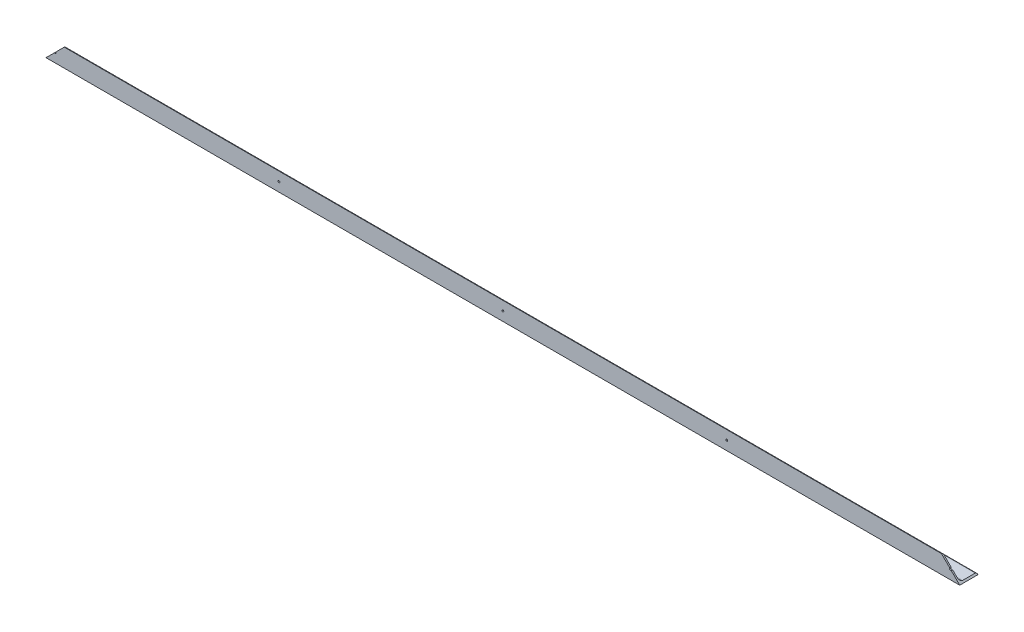
ISO-10303-21;
HEADER;
FILE_DESCRIPTION(('STEP AP214'),'2;1');
FILE_NAME('part.step','',(''),(''),'','','');
FILE_SCHEMA(('AUTOMOTIVE_DESIGN { 1 0 10303 214 1 1 1 1 }'));
ENDSEC;
DATA;
#1=APPLICATION_CONTEXT('core data for automotive mechanical design processes');
#2=APPLICATION_PROTOCOL_DEFINITION('international standard','automotive_design',2000,#1);
#3=PRODUCT_CONTEXT('',#1,'mechanical');
#4=PRODUCT('Part','Part','',(#3));
#5=PRODUCT_RELATED_PRODUCT_CATEGORY('part','',(#4));
#6=PRODUCT_DEFINITION_FORMATION('','',#4);
#7=PRODUCT_DEFINITION_CONTEXT('part definition',#1,'design');
#8=PRODUCT_DEFINITION('design','',#6,#7);
#9=PRODUCT_DEFINITION_SHAPE('','',#8);
#10=(LENGTH_UNIT() NAMED_UNIT(*) SI_UNIT(.MILLI.,.METRE.));
#11=(NAMED_UNIT(*) PLANE_ANGLE_UNIT() SI_UNIT($,.RADIAN.));
#12=(NAMED_UNIT(*) SI_UNIT($,.STERADIAN.) SOLID_ANGLE_UNIT());
#13=UNCERTAINTY_MEASURE_WITH_UNIT(LENGTH_MEASURE(1.E-05),#10,'distance_accuracy_value','');
#14=(GEOMETRIC_REPRESENTATION_CONTEXT(3) GLOBAL_UNCERTAINTY_ASSIGNED_CONTEXT((#13)) GLOBAL_UNIT_ASSIGNED_CONTEXT((#10,
#11,#12)) REPRESENTATION_CONTEXT('',''));
#15=CARTESIAN_POINT('',(0.,0.,0.));
#16=DIRECTION('',(0.,0.,1.));
#17=DIRECTION('',(1.,0.,0.));
#18=AXIS2_PLACEMENT_3D('',#15,#16,#17);
#19=CARTESIAN_POINT('',(2000.,0.,-40.));
#20=DIRECTION('',(0.,1.,0.));
#21=DIRECTION('',(0.,0.,1.));
#22=AXIS2_PLACEMENT_3D('',#19,#20,#21);
#23=PLANE('',#22);
#24=DIRECTION('',(0.,0.,-1.));
#25=VECTOR('',#24,1.);
#26=CARTESIAN_POINT('',(0.,0.,-40.));
#27=LINE('',#26,#25);
#28=CARTESIAN_POINT('',(0.,0.,0.));
#29=VERTEX_POINT('',#28);
#30=CARTESIAN_POINT('',(0.,0.,-40.));
#31=VERTEX_POINT('',#30);
#32=EDGE_CURVE('E163',#29,#31,#27,.T.);
#33=ORIENTED_EDGE('',*,*,#32,.T.);
#34=DIRECTION('',(-1.,0.,0.));
#35=VECTOR('',#34,1.);
#36=CARTESIAN_POINT('',(2000.,0.,-40.));
#37=LINE('',#36,#35);
#38=CARTESIAN_POINT('',(2000.,0.,-40.));
#39=VERTEX_POINT('',#38);
#40=EDGE_CURVE('E13',#39,#31,#37,.T.);
#41=ORIENTED_EDGE('',*,*,#40,.F.);
#42=DIRECTION('',(0.,0.,-1.));
#43=VECTOR('',#42,1.);
#44=CARTESIAN_POINT('',(2000.,0.,-40.));
#45=LINE('',#44,#43);
#46=CARTESIAN_POINT('',(2000.,0.,0.));
#47=VERTEX_POINT('',#46);
#48=EDGE_CURVE('E270',#47,#39,#45,.T.);
#49=ORIENTED_EDGE('',*,*,#48,.F.);
#50=DIRECTION('',(-1.,0.,0.));
#51=VECTOR('',#50,1.);
#52=CARTESIAN_POINT('',(2000.,0.,0.));
#53=LINE('',#52,#51);
#54=EDGE_CURVE('E273',#47,#29,#53,.T.);
#55=ORIENTED_EDGE('',*,*,#54,.T.);
#56=EDGE_LOOP('',(#33,#41,#49,#55));
#57=FACE_BOUND('',#56,.T.);
#58=ADVANCED_FACE('F65',(#57),#23,.F.);
#59=CARTESIAN_POINT('',(2000.,0.,-37.));
#60=DIRECTION('',(-1.,0.,0.));
#61=DIRECTION('',(0.,0.,1.));
#62=AXIS2_PLACEMENT_3D('',#59,#60,#61);
#63=CYLINDRICAL_SURFACE('',#62,3.);
#64=ORIENTED_EDGE('',*,*,#40,.T.);
#65=CARTESIAN_POINT('',(0.,0.,-37.));
#66=DIRECTION('',(0.707106781186548,-0.707106781186548,0.));
#67=DIRECTION('',(-0.707106781186548,-0.707106781186548,0.));
#68=AXIS2_PLACEMENT_3D('',#65,#66,#67);
#69=ELLIPSE('',#68,4.24264068711928,3.);
#70=CARTESIAN_POINT('',(3.00000000000011,3.,-37.));
#71=VERTEX_POINT('',#70);
#72=EDGE_CURVE('E216',#31,#71,#69,.T.);
#73=ORIENTED_EDGE('',*,*,#72,.T.);
#74=DIRECTION('',(-1.,0.,0.));
#75=VECTOR('',#74,1.);
#76=CARTESIAN_POINT('',(2000.,3.,-37.));
#77=LINE('',#76,#75);
#78=CARTESIAN_POINT('',(1997.,3.,-37.));
#79=VERTEX_POINT('',#78);
#80=EDGE_CURVE('E74',#79,#71,#77,.T.);
#81=ORIENTED_EDGE('',*,*,#80,.F.);
#82=CARTESIAN_POINT('',(2000.,0.,-37.));
#83=DIRECTION('',(-0.707106781186552,-0.707106781186543,0.));
#84=DIRECTION('',(-0.707106781186543,0.707106781186552,0.));
#85=AXIS2_PLACEMENT_3D('',#82,#83,#84);
#86=ELLIPSE('',#85,4.24264068711925,3.);
#87=EDGE_CURVE('E232',#79,#39,#86,.T.);
#88=ORIENTED_EDGE('',*,*,#87,.T.);
#89=EDGE_LOOP('',(#64,#73,#81,#88));
#90=FACE_BOUND('',#89,.T.);
#91=ADVANCED_FACE('F299',(#90),#63,.T.);
#92=CARTESIAN_POINT('',(2000.,3.,-9.));
#93=DIRECTION('',(0.,-1.,0.));
#94=DIRECTION('',(0.,0.,-1.));
#95=AXIS2_PLACEMENT_3D('',#92,#93,#94);
#96=PLANE('',#95);
#97=ORIENTED_EDGE('',*,*,#80,.T.);
#98=DIRECTION('',(0.,0.,1.));
#99=VECTOR('',#98,1.);
#100=CARTESIAN_POINT('',(3.00000000000011,3.,-9.));
#101=LINE('',#100,#99);
#102=CARTESIAN_POINT('',(3.00000000000011,3.,-9.00000000000001));
#103=VERTEX_POINT('',#102);
#104=EDGE_CURVE('E212',#71,#103,#101,.T.);
#105=ORIENTED_EDGE('',*,*,#104,.T.);
#106=DIRECTION('',(-1.,0.,0.));
#107=VECTOR('',#106,1.);
#108=CARTESIAN_POINT('',(2000.,3.,-9.00000000000001));
#109=LINE('',#108,#107);
#110=CARTESIAN_POINT('',(1997.,3.,-9.00000000000001));
#111=VERTEX_POINT('',#110);
#112=EDGE_CURVE('E289',#111,#103,#109,.T.);
#113=ORIENTED_EDGE('',*,*,#112,.F.);
#114=DIRECTION('',(0.,0.,-1.));
#115=VECTOR('',#114,1.);
#116=CARTESIAN_POINT('',(1997.,3.,-9.));
#117=LINE('',#116,#115);
#118=EDGE_CURVE('E228',#111,#79,#117,.T.);
#119=ORIENTED_EDGE('',*,*,#118,.T.);
#120=EDGE_LOOP('',(#97,#105,#113,#119));
#121=FACE_BOUND('',#120,.T.);
#122=ADVANCED_FACE('F296',(#121),#96,.F.);
#123=CARTESIAN_POINT('',(2000.,9.,-9.));
#124=DIRECTION('',(-1.,0.,0.));
#125=DIRECTION('',(0.,0.,1.));
#126=AXIS2_PLACEMENT_3D('',#123,#124,#125);
#127=CYLINDRICAL_SURFACE('',#126,6.);
#128=ORIENTED_EDGE('',*,*,#112,.T.);
#129=CARTESIAN_POINT('',(8.9999999999999,9.,-9.));
#130=DIRECTION('',(0.707106781186548,-0.707106781186548,0.));
#131=DIRECTION('',(-0.707106781186548,-0.707106781186548,0.));
#132=AXIS2_PLACEMENT_3D('',#129,#130,#131);
#133=ELLIPSE('',#132,8.48528137423857,6.);
#134=CARTESIAN_POINT('',(9.00000000000012,9.00000000000012,-3.));
#135=VERTEX_POINT('',#134);
#136=EDGE_CURVE('E208',#103,#135,#133,.F.);
#137=ORIENTED_EDGE('',*,*,#136,.T.);
#138=DIRECTION('',(-1.,0.,0.));
#139=VECTOR('',#138,1.);
#140=CARTESIAN_POINT('',(2000.,9.,-3.));
#141=LINE('',#140,#139);
#142=CARTESIAN_POINT('',(1991.,9.,-3.));
#143=VERTEX_POINT('',#142);
#144=EDGE_CURVE('E285',#143,#135,#141,.T.);
#145=ORIENTED_EDGE('',*,*,#144,.F.);
#146=CARTESIAN_POINT('',(1991.,9.,-9.));
#147=DIRECTION('',(-0.707106781186552,-0.707106781186543,0.));
#148=DIRECTION('',(-0.707106781186543,0.707106781186552,0.));
#149=AXIS2_PLACEMENT_3D('',#146,#147,#148);
#150=ELLIPSE('',#149,8.48528137423851,6.);
#151=EDGE_CURVE('E224',#143,#111,#150,.F.);
#152=ORIENTED_EDGE('',*,*,#151,.T.);
#153=EDGE_LOOP('',(#128,#137,#145,#152));
#154=FACE_BOUND('',#153,.T.);
#155=ADVANCED_FACE('F303',(#154),#127,.F.);
#156=CARTESIAN_POINT('',(2000.,37.,-3.));
#157=DIRECTION('',(0.,0.,1.));
#158=DIRECTION('',(1.,0.,0.));
#159=AXIS2_PLACEMENT_3D('',#156,#157,#158);
#160=PLANE('',#159);
#161=ORIENTED_EDGE('',*,*,#144,.T.);
#162=DIRECTION('',(0.707106781186548,0.707106781186548,0.));
#163=VECTOR('',#162,1.);
#164=CARTESIAN_POINT('',(1018.5,1018.5,-3.));
#165=LINE('',#164,#163);
#166=CARTESIAN_POINT('',(18.5857864376269,18.5857864376269,-3.));
#167=VERTEX_POINT('',#166);
#168=EDGE_CURVE('E177',#135,#167,#165,.T.);
#169=ORIENTED_EDGE('',*,*,#168,.T.);
#170=CARTESIAN_POINT('',(20.,20.,-3.));
#171=DIRECTION('',(0.,0.,1.));
#172=DIRECTION('',(1.,0.,0.));
#173=AXIS2_PLACEMENT_3D('',#170,#171,#172);
#174=CIRCLE('',#173,2.);
#175=CARTESIAN_POINT('',(21.4142135623731,21.4142135623731,-3.));
#176=VERTEX_POINT('',#175);
#177=EDGE_CURVE('E152',#167,#176,#174,.T.);
#178=ORIENTED_EDGE('',*,*,#177,.T.);
#179=DIRECTION('',(0.707106781186548,0.707106781186548,0.));
#180=VECTOR('',#179,1.);
#181=CARTESIAN_POINT('',(1018.5,1018.5,-3.));
#182=LINE('',#181,#180);
#183=CARTESIAN_POINT('',(37.0000000000001,37.,-3.));
#184=VERTEX_POINT('',#183);
#185=EDGE_CURVE('E266',#176,#184,#182,.T.);
#186=ORIENTED_EDGE('',*,*,#185,.T.);
#187=DIRECTION('',(-1.,0.,0.));
#188=VECTOR('',#187,1.);
#189=CARTESIAN_POINT('',(2000.,37.,-3.));
#190=LINE('',#189,#188);
#191=CARTESIAN_POINT('',(1963.,37.,-3.));
#192=VERTEX_POINT('',#191);
#193=EDGE_CURVE('E281',#192,#184,#190,.T.);
#194=ORIENTED_EDGE('',*,*,#193,.F.);
#195=DIRECTION('',(0.707106781186544,-0.707106781186551,0.));
#196=VECTOR('',#195,1.);
#197=CARTESIAN_POINT('',(1981.5,18.5000000000001,-3.));
#198=LINE('',#197,#196);
#199=CARTESIAN_POINT('',(1978.58578643763,21.4142135623733,-3.));
#200=VERTEX_POINT('',#199);
#201=EDGE_CURVE('E240',#192,#200,#198,.T.);
#202=ORIENTED_EDGE('',*,*,#201,.T.);
#203=CARTESIAN_POINT('',(1980.,20.,-3.));
#204=DIRECTION('',(0.,0.,1.));
#205=DIRECTION('',(1.,0.,0.));
#206=AXIS2_PLACEMENT_3D('',#203,#204,#205);
#207=CIRCLE('',#206,2.00000000000004);
#208=CARTESIAN_POINT('',(1981.41421356237,18.5857864376267,-3.));
#209=VERTEX_POINT('',#208);
#210=EDGE_CURVE('E244',#200,#209,#207,.T.);
#211=ORIENTED_EDGE('',*,*,#210,.T.);
#212=DIRECTION('',(0.707106781186543,-0.707106781186552,0.));
#213=VECTOR('',#212,1.);
#214=CARTESIAN_POINT('',(1981.5,18.5000000000003,-3.));
#215=LINE('',#214,#213);
#216=EDGE_CURVE('E220',#209,#143,#215,.T.);
#217=ORIENTED_EDGE('',*,*,#216,.T.);
#218=EDGE_LOOP('',(#161,#169,#178,#186,#194,#202,#211,#217));
#219=FACE_BOUND('',#218,.T.);
#220=CARTESIAN_POINT('',(1490.,20.,-3.));
#221=DIRECTION('',(0.,0.,1.));
#222=DIRECTION('',(1.,0.,0.));
#223=AXIS2_PLACEMENT_3D('',#220,#221,#222);
#224=CIRCLE('',#223,2.0000000000001);
#225=CARTESIAN_POINT('',(1492.,20.,-3.));
#226=VERTEX_POINT('',#225);
#227=EDGE_CURVE('E256',#226,#226,#224,.T.);
#228=ORIENTED_EDGE('',*,*,#227,.T.);
#229=EDGE_LOOP('',(#228));
#230=FACE_BOUND('',#229,.T.);
#231=CARTESIAN_POINT('',(510.,20.,-3.));
#232=DIRECTION('',(0.,0.,1.));
#233=DIRECTION('',(1.,0.,0.));
#234=AXIS2_PLACEMENT_3D('',#231,#232,#233);
#235=CIRCLE('',#234,2.);
#236=CARTESIAN_POINT('',(512.,20.,-3.));
#237=VERTEX_POINT('',#236);
#238=EDGE_CURVE('E252',#237,#237,#235,.T.);
#239=ORIENTED_EDGE('',*,*,#238,.T.);
#240=EDGE_LOOP('',(#239));
#241=FACE_BOUND('',#240,.T.);
#242=CARTESIAN_POINT('',(1000.,20.,-3.));
#243=DIRECTION('',(0.,0.,1.));
#244=DIRECTION('',(1.,0.,0.));
#245=AXIS2_PLACEMENT_3D('',#242,#243,#244);
#246=CIRCLE('',#245,2.0000000000001);
#247=CARTESIAN_POINT('',(1002.,20.,-3.));
#248=VERTEX_POINT('',#247);
#249=EDGE_CURVE('E248',#248,#248,#246,.T.);
#250=ORIENTED_EDGE('',*,*,#249,.T.);
#251=EDGE_LOOP('',(#250));
#252=FACE_BOUND('',#251,.T.);
#253=ADVANCED_FACE('F305',(#219,#230,#241,#252),#160,.F.);
#254=CARTESIAN_POINT('',(2000.,37.,0.));
#255=DIRECTION('',(-1.,0.,0.));
#256=DIRECTION('',(0.,0.,1.));
#257=AXIS2_PLACEMENT_3D('',#254,#255,#256);
#258=CYLINDRICAL_SURFACE('',#257,3.);
#259=ORIENTED_EDGE('',*,*,#193,.T.);
#260=CARTESIAN_POINT('',(37.0000000000001,37.,0.));
#261=DIRECTION('',(0.707106781186548,-0.707106781186548,0.));
#262=DIRECTION('',(-0.707106781186548,-0.707106781186548,0.));
#263=AXIS2_PLACEMENT_3D('',#260,#261,#262);
#264=ELLIPSE('',#263,4.24264068711929,3.);
#265=CARTESIAN_POINT('',(40.,40.,0.));
#266=VERTEX_POINT('',#265);
#267=EDGE_CURVE('E262',#184,#266,#264,.T.);
#268=ORIENTED_EDGE('',*,*,#267,.T.);
#269=DIRECTION('',(-1.,0.,0.));
#270=VECTOR('',#269,1.);
#271=CARTESIAN_POINT('',(2000.,40.,0.));
#272=LINE('',#271,#270);
#273=CARTESIAN_POINT('',(1960.,40.0000000000004,0.));
#274=VERTEX_POINT('',#273);
#275=EDGE_CURVE('E278',#274,#266,#272,.T.);
#276=ORIENTED_EDGE('',*,*,#275,.F.);
#277=CARTESIAN_POINT('',(1963.,37.,0.));
#278=DIRECTION('',(-0.707106781186551,-0.707106781186544,0.));
#279=DIRECTION('',(-0.707106781186544,0.707106781186551,0.));
#280=AXIS2_PLACEMENT_3D('',#277,#278,#279);
#281=ELLIPSE('',#280,4.24264068711927,3.);
#282=EDGE_CURVE('E236',#274,#192,#281,.T.);
#283=ORIENTED_EDGE('',*,*,#282,.T.);
#284=EDGE_LOOP('',(#259,#268,#276,#283));
#285=FACE_BOUND('',#284,.T.);
#286=ADVANCED_FACE('F329',(#285),#258,.T.);
#287=CARTESIAN_POINT('',(2000.,40.,0.));
#288=DIRECTION('',(0.,0.,-1.));
#289=DIRECTION('',(-1.,0.,0.));
#290=AXIS2_PLACEMENT_3D('',#287,#288,#289);
#291=PLANE('',#290);
#292=CARTESIAN_POINT('',(1490.,20.,0.));
#293=DIRECTION('',(0.,0.,1.));
#294=DIRECTION('',(1.,0.,0.));
#295=AXIS2_PLACEMENT_3D('',#292,#293,#294);
#296=CIRCLE('',#295,2.0000000000001);
#297=CARTESIAN_POINT('',(1492.,20.,0.));
#298=VERTEX_POINT('',#297);
#299=EDGE_CURVE('E184',#298,#298,#296,.T.);
#300=ORIENTED_EDGE('',*,*,#299,.F.);
#301=EDGE_LOOP('',(#300));
#302=FACE_BOUND('',#301,.T.);
#303=CARTESIAN_POINT('',(510.,20.,0.));
#304=DIRECTION('',(0.,0.,1.));
#305=DIRECTION('',(1.,0.,0.));
#306=AXIS2_PLACEMENT_3D('',#303,#304,#305);
#307=CIRCLE('',#306,2.);
#308=CARTESIAN_POINT('',(512.,20.,0.));
#309=VERTEX_POINT('',#308);
#310=EDGE_CURVE('E179',#309,#309,#307,.T.);
#311=ORIENTED_EDGE('',*,*,#310,.F.);
#312=EDGE_LOOP('',(#311));
#313=FACE_BOUND('',#312,.T.);
#314=CARTESIAN_POINT('',(1000.,20.,0.));
#315=DIRECTION('',(0.,0.,1.));
#316=DIRECTION('',(1.,0.,0.));
#317=AXIS2_PLACEMENT_3D('',#314,#315,#316);
#318=CIRCLE('',#317,2.0000000000001);
#319=CARTESIAN_POINT('',(1002.,20.,0.));
#320=VERTEX_POINT('',#319);
#321=EDGE_CURVE('E183',#320,#320,#318,.T.);
#322=ORIENTED_EDGE('',*,*,#321,.F.);
#323=EDGE_LOOP('',(#322));
#324=FACE_BOUND('',#323,.T.);
#325=CARTESIAN_POINT('',(20.,20.,0.));
#326=DIRECTION('',(0.,0.,1.));
#327=DIRECTION('',(1.,0.,0.));
#328=AXIS2_PLACEMENT_3D('',#325,#326,#327);
#329=CIRCLE('',#328,2.);
#330=CARTESIAN_POINT('',(18.5857864376269,18.5857864376269,0.));
#331=VERTEX_POINT('',#330);
#332=CARTESIAN_POINT('',(21.4142135623731,21.4142135623731,0.));
#333=VERTEX_POINT('',#332);
#334=EDGE_CURVE('E149',#331,#333,#329,.T.);
#335=ORIENTED_EDGE('',*,*,#334,.F.);
#336=DIRECTION('',(0.707106781186548,0.707106781186548,0.));
#337=VECTOR('',#336,1.);
#338=CARTESIAN_POINT('',(0.,0.,0.));
#339=LINE('',#338,#337);
#340=EDGE_CURVE('E160',#29,#331,#339,.T.);
#341=ORIENTED_EDGE('',*,*,#340,.F.);
#342=ORIENTED_EDGE('',*,*,#54,.F.);
#343=DIRECTION('',(0.707106781186543,-0.707106781186552,0.));
#344=VECTOR('',#343,1.);
#345=CARTESIAN_POINT('',(1981.41421356237,18.5857864376271,0.));
#346=LINE('',#345,#344);
#347=CARTESIAN_POINT('',(1981.41421356237,18.5857864376267,0.));
#348=VERTEX_POINT('',#347);
#349=EDGE_CURVE('E80',#348,#47,#346,.T.);
#350=ORIENTED_EDGE('',*,*,#349,.F.);
#351=CARTESIAN_POINT('',(1980.,20.,0.));
#352=DIRECTION('',(0.,0.,1.));
#353=DIRECTION('',(1.,0.,0.));
#354=AXIS2_PLACEMENT_3D('',#351,#352,#353);
#355=CIRCLE('',#354,2.00000000000004);
#356=CARTESIAN_POINT('',(1978.58578643763,21.4142135623733,0.));
#357=VERTEX_POINT('',#356);
#358=EDGE_CURVE('E194',#357,#348,#355,.T.);
#359=ORIENTED_EDGE('',*,*,#358,.F.);
#360=DIRECTION('',(0.707106781186544,-0.707106781186551,0.));
#361=VECTOR('',#360,1.);
#362=CARTESIAN_POINT('',(1960.,40.0000000000004,0.));
#363=LINE('',#362,#361);
#364=EDGE_CURVE('E190',#274,#357,#363,.T.);
#365=ORIENTED_EDGE('',*,*,#364,.F.);
#366=ORIENTED_EDGE('',*,*,#275,.T.);
#367=DIRECTION('',(0.707106781186547,0.707106781186547,0.));
#368=VECTOR('',#367,1.);
#369=CARTESIAN_POINT('',(21.4142135623731,21.4142135623731,0.));
#370=LINE('',#369,#368);
#371=EDGE_CURVE('E157',#333,#266,#370,.T.);
#372=ORIENTED_EDGE('',*,*,#371,.F.);
#373=EDGE_LOOP('',(#335,#341,#342,#350,#359,#365,#366,#372));
#374=FACE_BOUND('',#373,.T.);
#375=ADVANCED_FACE('F169',(#302,#313,#324,#374),#291,.F.);
#376=CARTESIAN_POINT('',(21.4142135623731,21.4142135623731,-40.));
#377=DIRECTION('',(0.707106781186548,-0.707106781186548,0.));
#378=DIRECTION('',(0.707106781186548,0.707106781186548,0.));
#379=AXIS2_PLACEMENT_3D('',#376,#377,#378);
#380=PLANE('',#379);
#381=DIRECTION('',(0.,0.,1.));
#382=VECTOR('',#381,1.);
#383=CARTESIAN_POINT('',(21.4142135623731,21.4142135623731,-40.));
#384=LINE('',#383,#382);
#385=EDGE_CURVE('E156',#176,#333,#384,.T.);
#386=ORIENTED_EDGE('',*,*,#385,.T.);
#387=ORIENTED_EDGE('',*,*,#371,.T.);
#388=ORIENTED_EDGE('',*,*,#267,.F.);
#389=ORIENTED_EDGE('',*,*,#185,.F.);
#390=EDGE_LOOP('',(#386,#387,#388,#389));
#391=FACE_BOUND('',#390,.T.);
#392=ADVANCED_FACE('F335',(#391),#380,.F.);
#393=CARTESIAN_POINT('',(20.,20.,-40.));
#394=DIRECTION('',(0.,0.,1.));
#395=DIRECTION('',(1.,0.,0.));
#396=AXIS2_PLACEMENT_3D('',#393,#394,#395);
#397=CYLINDRICAL_SURFACE('',#396,2.);
#398=DIRECTION('',(0.,0.,1.));
#399=VECTOR('',#398,1.);
#400=CARTESIAN_POINT('',(18.5857864376269,18.5857864376269,-40.));
#401=LINE('',#400,#399);
#402=EDGE_CURVE('E144',#167,#331,#401,.T.);
#403=ORIENTED_EDGE('',*,*,#402,.T.);
#404=ORIENTED_EDGE('',*,*,#334,.T.);
#405=ORIENTED_EDGE('',*,*,#385,.F.);
#406=ORIENTED_EDGE('',*,*,#177,.F.);
#407=EDGE_LOOP('',(#403,#404,#405,#406));
#408=FACE_BOUND('',#407,.T.);
#409=ADVANCED_FACE('F146',(#408),#397,.F.);
#410=CARTESIAN_POINT('',(0.,0.,-40.));
#411=DIRECTION('',(0.707106781186548,-0.707106781186548,0.));
#412=DIRECTION('',(0.707106781186548,0.707106781186548,0.));
#413=AXIS2_PLACEMENT_3D('',#410,#411,#412);
#414=PLANE('',#413);
#415=ORIENTED_EDGE('',*,*,#32,.F.);
#416=ORIENTED_EDGE('',*,*,#340,.T.);
#417=ORIENTED_EDGE('',*,*,#402,.F.);
#418=ORIENTED_EDGE('',*,*,#168,.F.);
#419=ORIENTED_EDGE('',*,*,#136,.F.);
#420=ORIENTED_EDGE('',*,*,#104,.F.);
#421=ORIENTED_EDGE('',*,*,#72,.F.);
#422=EDGE_LOOP('',(#415,#416,#417,#418,#419,#420,#421));
#423=FACE_BOUND('',#422,.T.);
#424=ADVANCED_FACE('F161',(#423),#414,.F.);
#425=CARTESIAN_POINT('',(1980.,20.,-40.));
#426=DIRECTION('',(0.,0.,1.));
#427=DIRECTION('',(1.,0.,0.));
#428=AXIS2_PLACEMENT_3D('',#425,#426,#427);
#429=CYLINDRICAL_SURFACE('',#428,2.00000000000004);
#430=DIRECTION('',(0.,0.,1.));
#431=VECTOR('',#430,1.);
#432=CARTESIAN_POINT('',(1978.58578643763,21.4142135623733,-40.));
#433=LINE('',#432,#431);
#434=EDGE_CURVE('E198',#200,#357,#433,.T.);
#435=ORIENTED_EDGE('',*,*,#434,.T.);
#436=ORIENTED_EDGE('',*,*,#358,.T.);
#437=DIRECTION('',(0.,0.,1.));
#438=VECTOR('',#437,1.);
#439=CARTESIAN_POINT('',(1981.41421356237,18.5857864376267,-40.));
#440=LINE('',#439,#438);
#441=EDGE_CURVE('E167',#209,#348,#440,.T.);
#442=ORIENTED_EDGE('',*,*,#441,.F.);
#443=ORIENTED_EDGE('',*,*,#210,.F.);
#444=EDGE_LOOP('',(#435,#436,#442,#443));
#445=FACE_BOUND('',#444,.T.);
#446=ADVANCED_FACE('F310',(#445),#429,.F.);
#447=CARTESIAN_POINT('',(1960.,40.0000000000004,-40.));
#448=DIRECTION('',(-0.707106781186551,-0.707106781186544,0.));
#449=DIRECTION('',(0.707106781186544,-0.707106781186551,0.));
#450=AXIS2_PLACEMENT_3D('',#447,#448,#449);
#451=PLANE('',#450);
#452=ORIENTED_EDGE('',*,*,#282,.F.);
#453=ORIENTED_EDGE('',*,*,#364,.T.);
#454=ORIENTED_EDGE('',*,*,#434,.F.);
#455=ORIENTED_EDGE('',*,*,#201,.F.);
#456=EDGE_LOOP('',(#452,#453,#454,#455));
#457=FACE_BOUND('',#456,.T.);
#458=ADVANCED_FACE('F344',(#457),#451,.F.);
#459=CARTESIAN_POINT('',(1981.41421356237,18.5857864376271,-40.));
#460=DIRECTION('',(-0.707106781186552,-0.707106781186543,0.));
#461=DIRECTION('',(0.707106781186543,-0.707106781186552,0.));
#462=AXIS2_PLACEMENT_3D('',#459,#460,#461);
#463=PLANE('',#462);
#464=ORIENTED_EDGE('',*,*,#118,.F.);
#465=ORIENTED_EDGE('',*,*,#151,.F.);
#466=ORIENTED_EDGE('',*,*,#216,.F.);
#467=ORIENTED_EDGE('',*,*,#441,.T.);
#468=ORIENTED_EDGE('',*,*,#349,.T.);
#469=ORIENTED_EDGE('',*,*,#48,.T.);
#470=ORIENTED_EDGE('',*,*,#87,.F.);
#471=EDGE_LOOP('',(#464,#465,#466,#467,#468,#469,#470));
#472=FACE_BOUND('',#471,.T.);
#473=ADVANCED_FACE('F308',(#472),#463,.F.);
#474=CARTESIAN_POINT('',(1000.,20.,-40.));
#475=DIRECTION('',(0.,0.,1.));
#476=DIRECTION('',(1.,0.,0.));
#477=AXIS2_PLACEMENT_3D('',#474,#475,#476);
#478=CYLINDRICAL_SURFACE('',#477,2.0000000000001);
#479=ORIENTED_EDGE('',*,*,#321,.T.);
#480=EDGE_LOOP('',(#479));
#481=FACE_BOUND('',#480,.T.);
#482=ORIENTED_EDGE('',*,*,#249,.F.);
#483=EDGE_LOOP('',(#482));
#484=FACE_BOUND('',#483,.T.);
#485=ADVANCED_FACE('F337',(#481,#484),#478,.F.);
#486=CARTESIAN_POINT('',(510.,20.,-40.));
#487=DIRECTION('',(0.,0.,1.));
#488=DIRECTION('',(1.,0.,0.));
#489=AXIS2_PLACEMENT_3D('',#486,#487,#488);
#490=CYLINDRICAL_SURFACE('',#489,2.);
#491=ORIENTED_EDGE('',*,*,#310,.T.);
#492=EDGE_LOOP('',(#491));
#493=FACE_BOUND('',#492,.T.);
#494=ORIENTED_EDGE('',*,*,#238,.F.);
#495=EDGE_LOOP('',(#494));
#496=FACE_BOUND('',#495,.T.);
#497=ADVANCED_FACE('F340',(#493,#496),#490,.F.);
#498=CARTESIAN_POINT('',(1490.,20.,-40.));
#499=DIRECTION('',(0.,0.,1.));
#500=DIRECTION('',(1.,0.,0.));
#501=AXIS2_PLACEMENT_3D('',#498,#499,#500);
#502=CYLINDRICAL_SURFACE('',#501,2.0000000000001);
#503=ORIENTED_EDGE('',*,*,#299,.T.);
#504=EDGE_LOOP('',(#503));
#505=FACE_BOUND('',#504,.T.);
#506=ORIENTED_EDGE('',*,*,#227,.F.);
#507=EDGE_LOOP('',(#506));
#508=FACE_BOUND('',#507,.T.);
#509=ADVANCED_FACE('F350',(#505,#508),#502,.F.);
#510=CLOSED_SHELL('',(#58,#91,#122,#155,#253,#286,#375,#392,#409,#424,#446,#458,#473,#485,#497,#509));
#511=MANIFOLD_SOLID_BREP('B2',#510);
#512=ADVANCED_BREP_SHAPE_REPRESENTATION('',(#18,#511),#14);
#513=SHAPE_DEFINITION_REPRESENTATION(#9,#512);
ENDSEC;
END-ISO-10303-21;
